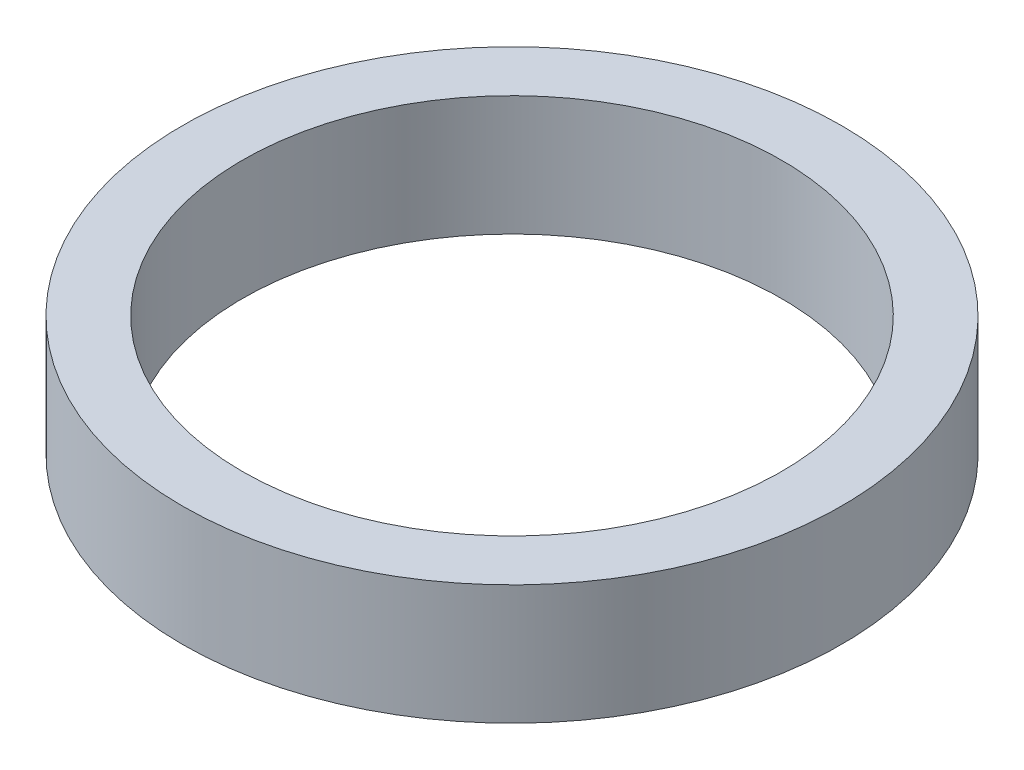
ISO-10303-21;
HEADER;
FILE_DESCRIPTION(('STEP AP214'),'2;1');
FILE_NAME('part.step','',(''),(''),'','','');
FILE_SCHEMA(('AUTOMOTIVE_DESIGN { 1 0 10303 214 1 1 1 1 }'));
ENDSEC;
DATA;
#1=APPLICATION_CONTEXT('core data for automotive mechanical design processes');
#2=APPLICATION_PROTOCOL_DEFINITION('international standard','automotive_design',2000,#1);
#3=PRODUCT_CONTEXT('',#1,'mechanical');
#4=PRODUCT('Part','Part','',(#3));
#5=PRODUCT_RELATED_PRODUCT_CATEGORY('part','',(#4));
#6=PRODUCT_DEFINITION_FORMATION('','',#4);
#7=PRODUCT_DEFINITION_CONTEXT('part definition',#1,'design');
#8=PRODUCT_DEFINITION('design','',#6,#7);
#9=PRODUCT_DEFINITION_SHAPE('','',#8);
#10=(LENGTH_UNIT() NAMED_UNIT(*) SI_UNIT(.MILLI.,.METRE.));
#11=(NAMED_UNIT(*) PLANE_ANGLE_UNIT() SI_UNIT($,.RADIAN.));
#12=(NAMED_UNIT(*) SI_UNIT($,.STERADIAN.) SOLID_ANGLE_UNIT());
#13=UNCERTAINTY_MEASURE_WITH_UNIT(LENGTH_MEASURE(1.E-05),#10,'distance_accuracy_value','');
#14=(GEOMETRIC_REPRESENTATION_CONTEXT(3) GLOBAL_UNCERTAINTY_ASSIGNED_CONTEXT((#13)) GLOBAL_UNIT_ASSIGNED_CONTEXT((#10,
#11,#12)) REPRESENTATION_CONTEXT('',''));
#15=CARTESIAN_POINT('',(0.,0.,0.));
#16=DIRECTION('',(0.,0.,1.));
#17=DIRECTION('',(1.,0.,0.));
#18=AXIS2_PLACEMENT_3D('',#15,#16,#17);
#19=CARTESIAN_POINT('',(0.,5.,0.));
#20=DIRECTION('',(0.,1.,0.));
#21=DIRECTION('',(0.,0.,1.));
#22=AXIS2_PLACEMENT_3D('',#19,#20,#21);
#23=PLANE('',#22);
#24=CARTESIAN_POINT('',(0.,5.,0.));
#25=DIRECTION('',(0.,1.,0.));
#26=DIRECTION('',(0.,0.,1.));
#27=AXIS2_PLACEMENT_3D('',#24,#25,#26);
#28=CIRCLE('',#27,27.5);
#29=CARTESIAN_POINT('',(0.,5.,27.5));
#30=VERTEX_POINT('',#29);
#31=EDGE_CURVE('E10',#30,#30,#28,.T.);
#32=ORIENTED_EDGE('',*,*,#31,.T.);
#33=EDGE_LOOP('',(#32));
#34=FACE_BOUND('',#33,.T.);
#35=CARTESIAN_POINT('',(0.,5.,0.));
#36=DIRECTION('',(0.,1.,0.));
#37=DIRECTION('',(0.,0.,1.));
#38=AXIS2_PLACEMENT_3D('',#35,#36,#37);
#39=CIRCLE('',#38,22.5);
#40=CARTESIAN_POINT('',(0.,5.,22.5));
#41=VERTEX_POINT('',#40);
#42=EDGE_CURVE('E42',#41,#41,#39,.T.);
#43=ORIENTED_EDGE('',*,*,#42,.F.);
#44=EDGE_LOOP('',(#43));
#45=FACE_BOUND('',#44,.T.);
#46=ADVANCED_FACE('F31',(#34,#45),#23,.T.);
#47=CARTESIAN_POINT('',(0.,-5.,0.));
#48=DIRECTION('',(0.,1.,0.));
#49=DIRECTION('',(0.,0.,1.));
#50=AXIS2_PLACEMENT_3D('',#47,#48,#49);
#51=PLANE('',#50);
#52=CARTESIAN_POINT('',(0.,-5.,0.));
#53=DIRECTION('',(0.,1.,0.));
#54=DIRECTION('',(0.,0.,1.));
#55=AXIS2_PLACEMENT_3D('',#52,#53,#54);
#56=CIRCLE('',#55,27.5);
#57=CARTESIAN_POINT('',(0.,-5.,27.5));
#58=VERTEX_POINT('',#57);
#59=EDGE_CURVE('E35',#58,#58,#56,.T.);
#60=ORIENTED_EDGE('',*,*,#59,.F.);
#61=EDGE_LOOP('',(#60));
#62=FACE_BOUND('',#61,.T.);
#63=CARTESIAN_POINT('',(0.,-5.,0.));
#64=DIRECTION('',(0.,1.,0.));
#65=DIRECTION('',(0.,0.,1.));
#66=AXIS2_PLACEMENT_3D('',#63,#64,#65);
#67=CIRCLE('',#66,22.5);
#68=CARTESIAN_POINT('',(0.,-5.,22.5));
#69=VERTEX_POINT('',#68);
#70=EDGE_CURVE('E44',#69,#69,#67,.T.);
#71=ORIENTED_EDGE('',*,*,#70,.T.);
#72=EDGE_LOOP('',(#71));
#73=FACE_BOUND('',#72,.T.);
#74=ADVANCED_FACE('F54',(#62,#73),#51,.F.);
#75=CARTESIAN_POINT('',(0.,5.,0.));
#76=DIRECTION('',(0.,-1.,0.));
#77=DIRECTION('',(0.,0.,-1.));
#78=AXIS2_PLACEMENT_3D('',#75,#76,#77);
#79=CYLINDRICAL_SURFACE('',#78,27.5);
#80=ORIENTED_EDGE('',*,*,#31,.F.);
#81=EDGE_LOOP('',(#80));
#82=FACE_BOUND('',#81,.T.);
#83=ORIENTED_EDGE('',*,*,#59,.T.);
#84=EDGE_LOOP('',(#83));
#85=FACE_BOUND('',#84,.T.);
#86=ADVANCED_FACE('F33',(#82,#85),#79,.T.);
#87=CARTESIAN_POINT('',(0.,5.,0.));
#88=DIRECTION('',(0.,-1.,0.));
#89=DIRECTION('',(0.,0.,-1.));
#90=AXIS2_PLACEMENT_3D('',#87,#88,#89);
#91=CYLINDRICAL_SURFACE('',#90,22.5);
#92=ORIENTED_EDGE('',*,*,#42,.T.);
#93=EDGE_LOOP('',(#92));
#94=FACE_BOUND('',#93,.T.);
#95=ORIENTED_EDGE('',*,*,#70,.F.);
#96=EDGE_LOOP('',(#95));
#97=FACE_BOUND('',#96,.T.);
#98=ADVANCED_FACE('F50',(#94,#97),#91,.F.);
#99=CLOSED_SHELL('',(#46,#74,#86,#98));
#100=MANIFOLD_SOLID_BREP('B2',#99);
#101=ADVANCED_BREP_SHAPE_REPRESENTATION('',(#18,#100),#14);
#102=SHAPE_DEFINITION_REPRESENTATION(#9,#101);
ENDSEC;
END-ISO-10303-21;
